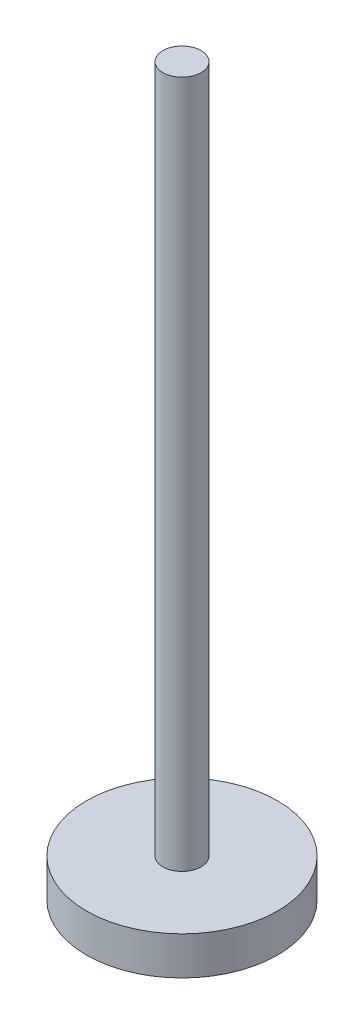
ISO-10303-21;
HEADER;
FILE_DESCRIPTION(('STEP AP214'),'2;1');
FILE_NAME('part.step','',(''),(''),'','','');
FILE_SCHEMA(('AUTOMOTIVE_DESIGN { 1 0 10303 214 1 1 1 1 }'));
ENDSEC;
DATA;
#1=APPLICATION_CONTEXT('core data for automotive mechanical design processes');
#2=APPLICATION_PROTOCOL_DEFINITION('international standard','automotive_design',2000,#1);
#3=PRODUCT_CONTEXT('',#1,'mechanical');
#4=PRODUCT('Part','Part','',(#3));
#5=PRODUCT_RELATED_PRODUCT_CATEGORY('part','',(#4));
#6=PRODUCT_DEFINITION_FORMATION('','',#4);
#7=PRODUCT_DEFINITION_CONTEXT('part definition',#1,'design');
#8=PRODUCT_DEFINITION('design','',#6,#7);
#9=PRODUCT_DEFINITION_SHAPE('','',#8);
#10=(LENGTH_UNIT() NAMED_UNIT(*) SI_UNIT(.MILLI.,.METRE.));
#11=(NAMED_UNIT(*) PLANE_ANGLE_UNIT() SI_UNIT($,.RADIAN.));
#12=(NAMED_UNIT(*) SI_UNIT($,.STERADIAN.) SOLID_ANGLE_UNIT());
#13=UNCERTAINTY_MEASURE_WITH_UNIT(LENGTH_MEASURE(1.E-05),#10,'distance_accuracy_value','');
#14=(GEOMETRIC_REPRESENTATION_CONTEXT(3) GLOBAL_UNCERTAINTY_ASSIGNED_CONTEXT((#13)) GLOBAL_UNIT_ASSIGNED_CONTEXT((#10,
#11,#12)) REPRESENTATION_CONTEXT('',''));
#15=CARTESIAN_POINT('',(0.,0.,0.));
#16=DIRECTION('',(0.,0.,1.));
#17=DIRECTION('',(1.,0.,0.));
#18=AXIS2_PLACEMENT_3D('',#15,#16,#17);
#19=CARTESIAN_POINT('',(0.999999999999997,19.,0.));
#20=DIRECTION('',(0.,-1.,0.));
#21=DIRECTION('',(1.,0.,0.));
#22=AXIS2_PLACEMENT_3D('',#19,#20,#21);
#23=CYLINDRICAL_SURFACE('',#22,0.500000000000001);
#24=CARTESIAN_POINT('',(0.999999999999997,19.,0.));
#25=DIRECTION('',(0.,-1.,0.));
#26=DIRECTION('',(1.,0.,0.));
#27=AXIS2_PLACEMENT_3D('',#24,#25,#26);
#28=CIRCLE('',#27,0.500000000000003);
#29=CARTESIAN_POINT('',(1.5,19.,0.));
#30=VERTEX_POINT('',#29);
#31=EDGE_CURVE('E10',#30,#30,#28,.T.);
#32=ORIENTED_EDGE('',*,*,#31,.T.);
#33=EDGE_LOOP('',(#32));
#34=FACE_BOUND('',#33,.T.);
#35=CARTESIAN_POINT('',(0.999999999999999,1.,0.));
#36=DIRECTION('',(0.,-1.,0.));
#37=DIRECTION('',(1.,0.,0.));
#38=AXIS2_PLACEMENT_3D('',#35,#36,#37);
#39=CIRCLE('',#38,0.5);
#40=CARTESIAN_POINT('',(1.5,1.,0.));
#41=VERTEX_POINT('',#40);
#42=EDGE_CURVE('E49',#41,#41,#39,.T.);
#43=ORIENTED_EDGE('',*,*,#42,.F.);
#44=EDGE_LOOP('',(#43));
#45=FACE_BOUND('',#44,.T.);
#46=ADVANCED_FACE('F35',(#34,#45),#23,.T.);
#47=CARTESIAN_POINT('',(1.5,19.,0.));
#48=DIRECTION('',(0.,1.,0.));
#49=DIRECTION('',(-1.,0.,0.));
#50=AXIS2_PLACEMENT_3D('',#47,#48,#49);
#51=PLANE('',#50);
#52=ORIENTED_EDGE('',*,*,#31,.F.);
#53=EDGE_LOOP('',(#52));
#54=FACE_BOUND('',#53,.T.);
#55=ADVANCED_FACE('F59',(#54),#51,.T.);
#56=CARTESIAN_POINT('',(1.,0.,0.));
#57=DIRECTION('',(0.,-1.,0.));
#58=DIRECTION('',(1.,0.,0.));
#59=AXIS2_PLACEMENT_3D('',#56,#57,#58);
#60=PLANE('',#59);
#61=CARTESIAN_POINT('',(1.,0.,0.));
#62=DIRECTION('',(0.,-1.,0.));
#63=DIRECTION('',(1.,0.,0.));
#64=AXIS2_PLACEMENT_3D('',#61,#62,#63);
#65=CIRCLE('',#64,2.5);
#66=CARTESIAN_POINT('',(3.5,0.,0.));
#67=VERTEX_POINT('',#66);
#68=EDGE_CURVE('E41',#67,#67,#65,.T.);
#69=ORIENTED_EDGE('',*,*,#68,.T.);
#70=EDGE_LOOP('',(#69));
#71=FACE_BOUND('',#70,.T.);
#72=ADVANCED_FACE('F63',(#71),#60,.T.);
#73=CARTESIAN_POINT('',(0.999999999999997,19.,0.));
#74=DIRECTION('',(0.,-1.,0.));
#75=DIRECTION('',(1.,0.,0.));
#76=AXIS2_PLACEMENT_3D('',#73,#74,#75);
#77=CYLINDRICAL_SURFACE('',#76,2.5);
#78=CARTESIAN_POINT('',(0.999999999999999,1.,0.));
#79=DIRECTION('',(0.,-1.,0.));
#80=DIRECTION('',(1.,0.,0.));
#81=AXIS2_PLACEMENT_3D('',#78,#79,#80);
#82=CIRCLE('',#81,2.5);
#83=CARTESIAN_POINT('',(3.5,1.,0.));
#84=VERTEX_POINT('',#83);
#85=EDGE_CURVE('E45',#84,#84,#82,.T.);
#86=ORIENTED_EDGE('',*,*,#85,.T.);
#87=EDGE_LOOP('',(#86));
#88=FACE_BOUND('',#87,.T.);
#89=ORIENTED_EDGE('',*,*,#68,.F.);
#90=EDGE_LOOP('',(#89));
#91=FACE_BOUND('',#90,.T.);
#92=ADVANCED_FACE('F68',(#88,#91),#77,.T.);
#93=CARTESIAN_POINT('',(3.5,1.,0.));
#94=DIRECTION('',(0.,1.,0.));
#95=DIRECTION('',(-1.,0.,0.));
#96=AXIS2_PLACEMENT_3D('',#93,#94,#95);
#97=PLANE('',#96);
#98=ORIENTED_EDGE('',*,*,#42,.T.);
#99=EDGE_LOOP('',(#98));
#100=FACE_BOUND('',#99,.T.);
#101=ORIENTED_EDGE('',*,*,#85,.F.);
#102=EDGE_LOOP('',(#101));
#103=FACE_BOUND('',#102,.T.);
#104=ADVANCED_FACE('F55',(#100,#103),#97,.T.);
#105=CLOSED_SHELL('',(#46,#55,#72,#92,#104));
#106=MANIFOLD_SOLID_BREP('B2',#105);
#107=ADVANCED_BREP_SHAPE_REPRESENTATION('',(#18,#106),#14);
#108=SHAPE_DEFINITION_REPRESENTATION(#9,#107);
ENDSEC;
END-ISO-10303-21;
